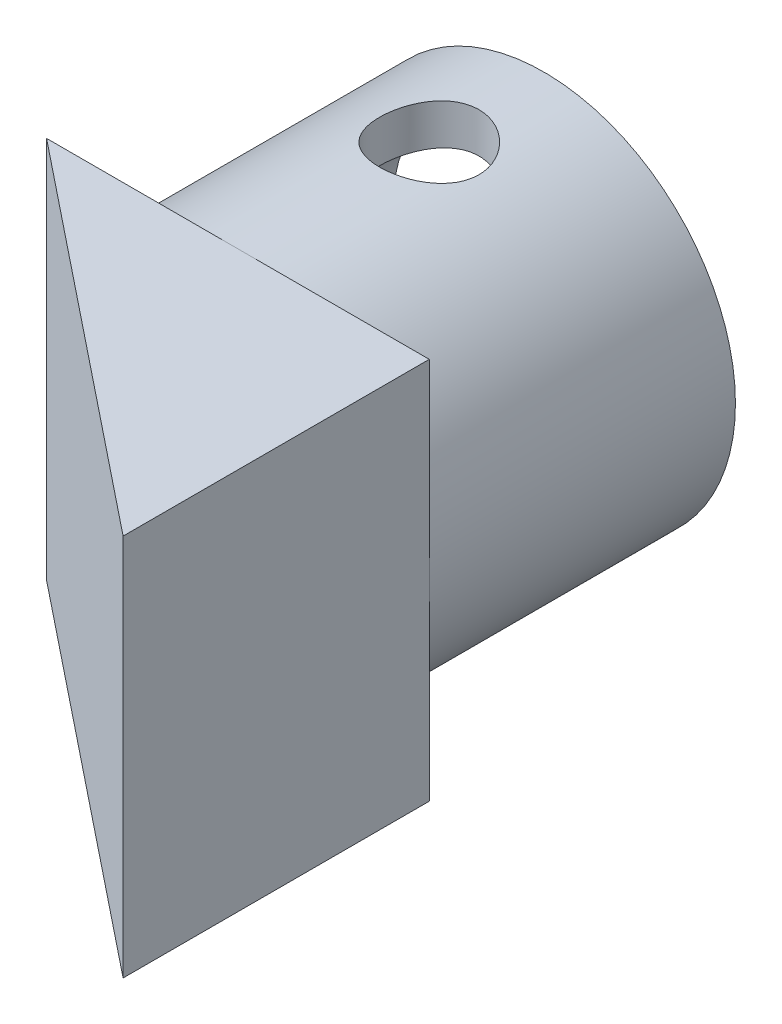
ISO-10303-21;
HEADER;
FILE_DESCRIPTION(('STEP AP214'),'2;1');
FILE_NAME('part.step','',(''),(''),'','','');
FILE_SCHEMA(('AUTOMOTIVE_DESIGN { 1 0 10303 214 1 1 1 1 }'));
ENDSEC;
DATA;
#1=APPLICATION_CONTEXT('core data for automotive mechanical design processes');
#2=APPLICATION_PROTOCOL_DEFINITION('international standard','automotive_design',2000,#1);
#3=PRODUCT_CONTEXT('',#1,'mechanical');
#4=PRODUCT('Part','Part','',(#3));
#5=PRODUCT_RELATED_PRODUCT_CATEGORY('part','',(#4));
#6=PRODUCT_DEFINITION_FORMATION('','',#4);
#7=PRODUCT_DEFINITION_CONTEXT('part definition',#1,'design');
#8=PRODUCT_DEFINITION('design','',#6,#7);
#9=PRODUCT_DEFINITION_SHAPE('','',#8);
#10=(LENGTH_UNIT() NAMED_UNIT(*) SI_UNIT(.MILLI.,.METRE.));
#11=(NAMED_UNIT(*) PLANE_ANGLE_UNIT() SI_UNIT($,.RADIAN.));
#12=(NAMED_UNIT(*) SI_UNIT($,.STERADIAN.) SOLID_ANGLE_UNIT());
#13=UNCERTAINTY_MEASURE_WITH_UNIT(LENGTH_MEASURE(1.E-05),#10,'distance_accuracy_value','');
#14=(GEOMETRIC_REPRESENTATION_CONTEXT(3) GLOBAL_UNCERTAINTY_ASSIGNED_CONTEXT((#13)) GLOBAL_UNIT_ASSIGNED_CONTEXT((#10,
#11,#12)) REPRESENTATION_CONTEXT('',''));
#15=CARTESIAN_POINT('',(0.,0.,0.));
#16=DIRECTION('',(0.,0.,1.));
#17=DIRECTION('',(1.,0.,0.));
#18=AXIS2_PLACEMENT_3D('',#15,#16,#17);
#19=CARTESIAN_POINT('',(0.,0.,0.));
#20=DIRECTION('',(0.,0.,1.));
#21=DIRECTION('',(1.,0.,0.));
#22=AXIS2_PLACEMENT_3D('',#19,#20,#21);
#23=PLANE('',#22);
#24=CARTESIAN_POINT('',(0.,0.,0.));
#25=DIRECTION('',(0.,0.,1.));
#26=DIRECTION('',(1.,0.,0.));
#27=AXIS2_PLACEMENT_3D('',#24,#25,#26);
#28=CIRCLE('',#27,5.);
#29=CARTESIAN_POINT('',(5.,0.,0.));
#30=VERTEX_POINT('',#29);
#31=EDGE_CURVE('E134',#30,#30,#28,.T.);
#32=ORIENTED_EDGE('',*,*,#31,.F.);
#33=EDGE_LOOP('',(#32));
#34=FACE_BOUND('',#33,.T.);
#35=CARTESIAN_POINT('',(0.,0.,0.));
#36=DIRECTION('',(0.,0.,1.));
#37=DIRECTION('',(1.,0.,0.));
#38=AXIS2_PLACEMENT_3D('',#35,#36,#37);
#39=CIRCLE('',#38,3.95);
#40=CARTESIAN_POINT('',(3.95,0.,0.));
#41=VERTEX_POINT('',#40);
#42=EDGE_CURVE('E132',#41,#41,#39,.T.);
#43=ORIENTED_EDGE('',*,*,#42,.T.);
#44=EDGE_LOOP('',(#43));
#45=FACE_BOUND('',#44,.T.);
#46=ADVANCED_FACE('F33',(#34,#45),#23,.F.);
#47=CARTESIAN_POINT('',(0.,0.,8.));
#48=DIRECTION('',(0.,0.,-1.));
#49=DIRECTION('',(-1.,0.,0.));
#50=AXIS2_PLACEMENT_3D('',#47,#48,#49);
#51=CYLINDRICAL_SURFACE('',#50,5.);
#52=CARTESIAN_POINT('',(0.,-5.,4.3));
#53=CARTESIAN_POINT('',(0.0717307786716109,-4.99999885912454,4.29999816586154));
#54=CARTESIAN_POINT('',(0.143481538947281,-4.998441140995,4.29404317706765));
#55=CARTESIAN_POINT('',(0.284920413497907,-4.99237823364744,4.2704200751648));
#56=CARTESIAN_POINT('',(0.354607444099347,-4.98787152361252,4.25274591833176));
#57=CARTESIAN_POINT('',(0.489856453463625,-4.97640871761101,4.20629469406177));
#58=CARTESIAN_POINT('',(0.555423483742325,-4.96945569296409,4.1775315444106));
#59=CARTESIAN_POINT('',(0.68080247992251,-4.95383737776702,4.10976934681149));
#60=CARTESIAN_POINT('',(0.740614138181474,-4.94517199576156,4.07076975210864));
#61=CARTESIAN_POINT('',(0.854108529262041,-4.92685216626646,3.98273009067953));
#62=CARTESIAN_POINT('',(0.907645708599976,-4.91718147538334,3.93350576070611));
#63=CARTESIAN_POINT('',(1.0058054182008,-4.89804673326225,3.82680807084766));
#64=CARTESIAN_POINT('',(1.05042685981889,-4.88858270738436,3.76933370507305));
#65=CARTESIAN_POINT('',(1.13018788316099,-4.87076767855598,3.64661851125556));
#66=CARTESIAN_POINT('',(1.16516190324781,-4.86243722215411,3.58126681773134));
#67=CARTESIAN_POINT('',(1.22356960439174,-4.84807058079245,3.44535959205325));
#68=CARTESIAN_POINT('',(1.24700529718818,-4.84203399593172,3.37480496951268));
#69=CARTESIAN_POINT('',(1.281169228899,-4.83310598130334,3.23210205052739));
#70=CARTESIAN_POINT('',(1.29216048290362,-4.83014956376373,3.16002088452016));
#71=CARTESIAN_POINT('',(1.3019432296733,-4.82752230668979,3.01498176997082));
#72=CARTESIAN_POINT('',(1.30073688084738,-4.82785088586354,2.94202397883275));
#73=CARTESIAN_POINT('',(1.2863678960504,-4.83169822957429,2.79934028716682));
#74=CARTESIAN_POINT('',(1.2735215273875,-4.83513260277125,2.72957990208878));
#75=CARTESIAN_POINT('',(1.23674288104121,-4.84466969943908,2.59324021046968));
#76=CARTESIAN_POINT('',(1.21280975642708,-4.85077262676204,2.52666114738238));
#77=CARTESIAN_POINT('',(1.15427447680391,-4.86503471141451,2.39774002853324));
#78=CARTESIAN_POINT('',(1.11955986166448,-4.87321536914182,2.33545151285766));
#79=CARTESIAN_POINT('',(1.04052555441476,-4.89069936804917,2.21747178012729));
#80=CARTESIAN_POINT('',(0.996204056417375,-4.90000292016326,2.16178180650457));
#81=CARTESIAN_POINT('',(0.897588399354158,-4.9190373655284,2.0567707801978));
#82=CARTESIAN_POINT('',(0.843028117151478,-4.92877257463288,2.00770008928812));
#83=CARTESIAN_POINT('',(0.726334791666221,-4.947314710364,1.91935513083208));
#84=CARTESIAN_POINT('',(0.664201478488647,-4.95612160388557,1.88008121258463));
#85=CARTESIAN_POINT('',(0.533750553018985,-4.97186464472852,1.81234191921762));
#86=CARTESIAN_POINT('',(0.465409427094992,-4.97879324641701,1.78391995820683));
#87=CARTESIAN_POINT('',(0.324698261892371,-4.98994437896931,1.73903950096387));
#88=CARTESIAN_POINT('',(0.25232906151994,-4.99416747102063,1.72257852364206));
#89=CARTESIAN_POINT('',(0.107754265628856,-4.99934762845146,1.70247601810568));
#90=CARTESIAN_POINT('',(0.0355990679618569,-5.00039144909205,1.69849388039378));
#91=CARTESIAN_POINT('',(-0.108347558385988,-4.9993439302767,1.70252407708697));
#92=CARTESIAN_POINT('',(-0.180139021986154,-4.99725289772412,1.71053523734338));
#93=CARTESIAN_POINT('',(-0.320117661841459,-4.9902264842307,1.73804465756627));
#94=CARTESIAN_POINT('',(-0.3883443967086,-4.98533775354441,1.75735463113079));
#95=CARTESIAN_POINT('',(-0.520584855265785,-4.97326895706077,1.80669635149957));
#96=CARTESIAN_POINT('',(-0.584598133561371,-4.966088649494,1.83672922964772));
#97=CARTESIAN_POINT('',(-0.707930992016775,-4.95002802767655,1.90730750951055));
#98=CARTESIAN_POINT('',(-0.767139321552233,-4.94111821378144,1.94804043928579));
#99=CARTESIAN_POINT('',(-0.878000441471827,-4.92262930746647,2.03862522166252));
#100=CARTESIAN_POINT('',(-0.929651812778711,-4.91305008984093,2.08847878302904));
#101=CARTESIAN_POINT('',(-1.02535533145664,-4.89398559724572,2.19747610283433));
#102=CARTESIAN_POINT('',(-1.0691676974822,-4.88450966299983,2.25683240802754));
#103=CARTESIAN_POINT('',(-1.14621298401497,-4.86700757475785,2.38225303325104));
#104=CARTESIAN_POINT('',(-1.1794463607291,-4.85898135825078,2.44831706385618));
#105=CARTESIAN_POINT('',(-1.23414034237999,-4.84537844502717,2.58493610486184));
#106=CARTESIAN_POINT('',(-1.25567007103908,-4.83978740561989,2.65546193804776));
#107=CARTESIAN_POINT('',(-1.28651743722663,-4.83168004742566,2.79930171484937));
#108=CARTESIAN_POINT('',(-1.29583800946139,-4.82916298975776,2.87261498408958));
#109=CARTESIAN_POINT('',(-1.30183988013393,-4.82754813134566,3.01749983369733));
#110=CARTESIAN_POINT('',(-1.29890566929442,-4.82834631145179,3.08905457201614));
#111=CARTESIAN_POINT('',(-1.28136829919157,-4.83302969132189,3.2306112653395));
#112=CARTESIAN_POINT('',(-1.26676541261453,-4.83691481894669,3.30061325659105));
#113=CARTESIAN_POINT('',(-1.22652296626336,-4.84727400349191,3.43662027692297));
#114=CARTESIAN_POINT('',(-1.20096107281371,-4.85372981947422,3.5026497724797));
#115=CARTESIAN_POINT('',(-1.13958690119683,-4.86850424398437,3.62953183040472));
#116=CARTESIAN_POINT('',(-1.10377308914157,-4.87682313122364,3.6903836163174));
#117=CARTESIAN_POINT('',(-1.02173013022611,-4.89467814244603,3.8070274672692));
#118=CARTESIAN_POINT('',(-0.975236798928221,-4.90424188358561,3.86262951434169));
#119=CARTESIAN_POINT('',(-0.87366206477925,-4.92335054739323,3.96536747478793));
#120=CARTESIAN_POINT('',(-0.818578597936101,-4.93289546497886,4.01250134760105));
#121=CARTESIAN_POINT('',(-0.700055598942872,-4.95111947868785,4.09789014611913));
#122=CARTESIAN_POINT('',(-0.636470787048337,-4.9597774014975,4.13594830359197));
#123=CARTESIAN_POINT('',(-0.503584101499031,-4.97502379799897,4.20077479935966));
#124=CARTESIAN_POINT('',(-0.434286110017087,-4.9816136625622,4.22755072968078));
#125=CARTESIAN_POINT('',(-0.304324490623244,-4.99107925028337,4.26536273677146));
#126=CARTESIAN_POINT('',(-0.244245830872915,-4.99440072931575,4.27832240703174));
#127=CARTESIAN_POINT('',(-0.122782916586036,-4.99886149574191,4.29564144249486));
#128=CARTESIAN_POINT('',(-0.0613987782532484,-5.00000097654536,4.30000156995174));
#129=CARTESIAN_POINT('',(0.,-5.,4.3));
#130=B_SPLINE_CURVE_WITH_KNOTS('',3,(#52,#53,#54,#55,#56,#57,#58,#59,#60,#61,#62,#63,#64,#65,
#66,#67,#68,#69,#70,#71,#72,#73,#74,#75,#76,#77,#78,#79,#80,#81,#82,#83,#84,#85,#86,#87,#88,#89,
#90,#91,#92,#93,#94,#95,#96,#97,#98,#99,#100,#101,#102,#103,#104,#105,#106,#107,#108,#109,#110,
#111,#112,#113,#114,#115,#116,#117,#118,#119,#120,#121,#122,#123,#124,#125,#126,#127,#128,#129),
.UNSPECIFIED.,.T.,.F.,(4,2,2,2,2,2,2,2,2,2,2,2,2,2,2,2,2,2,2,2,2,2,2,2,2,2,2,2,2,2,2,2,2,2,2,2,
2,2,4),(0.,0.214967237033415,0.43004542172036,0.64485453617895,0.859675126481417,
1.07876816860036,1.29788794646979,1.52056237814132,1.74319797214783,1.96103475933145,
2.17883300019886,2.39088534386669,2.60295388914234,2.8173133212086,3.03171308323144,
3.25274629224052,3.47378738094936,3.69570372080879,3.91757401498792,4.13333313105578,
4.34907112560078,4.56131245775761,4.77357618952829,4.98984196043499,5.20614829065226,
5.42823125959202,5.65030465015768,5.87105177957784,6.09174583842406,6.30556854774109,
6.51938626036272,6.73171306829717,6.94407166110446,7.16239228611878,7.38076544910422,
7.60351288552391,7.82611019062644,8.01013016140658,8.19413382012542),.UNSPECIFIED.);
#131=CARTESIAN_POINT('',(0.,-5.,4.3));
#132=VERTEX_POINT('',#131);
#133=EDGE_CURVE('E97',#132,#132,#130,.T.);
#134=ORIENTED_EDGE('',*,*,#133,.T.);
#135=EDGE_LOOP('',(#134));
#136=FACE_BOUND('',#135,.T.);
#137=CARTESIAN_POINT('',(0.,5.,4.3));
#138=CARTESIAN_POINT('',(-0.0717307786716105,4.99999885912454,4.29999816586154));
#139=CARTESIAN_POINT('',(-0.14348153894728,4.998441140995,4.29404317706765));
#140=CARTESIAN_POINT('',(-0.284920413497907,4.99237823364744,4.2704200751648));
#141=CARTESIAN_POINT('',(-0.354607444099346,4.98787152361252,4.25274591833175));
#142=CARTESIAN_POINT('',(-0.489856453463625,4.97640871761101,4.20629469406177));
#143=CARTESIAN_POINT('',(-0.555423483742325,4.96945569296409,4.1775315444106));
#144=CARTESIAN_POINT('',(-0.680802479922511,4.95383737776702,4.10976934681149));
#145=CARTESIAN_POINT('',(-0.740614138181474,4.94517199576156,4.07076975210864));
#146=CARTESIAN_POINT('',(-0.854108529262042,4.92685216626645,3.98273009067953));
#147=CARTESIAN_POINT('',(-0.907645708599977,4.91718147538334,3.93350576070611));
#148=CARTESIAN_POINT('',(-1.0058054182008,4.89804673326225,3.82680807084766));
#149=CARTESIAN_POINT('',(-1.05042685981889,4.88858270738436,3.76933370507305));
#150=CARTESIAN_POINT('',(-1.13018788316099,4.87076767855598,3.64661851125556));
#151=CARTESIAN_POINT('',(-1.16516190324781,4.86243722215411,3.58126681773134));
#152=CARTESIAN_POINT('',(-1.22356960439173,4.84807058079245,3.44535959205325));
#153=CARTESIAN_POINT('',(-1.24700529718818,4.84203399593172,3.37480496951268));
#154=CARTESIAN_POINT('',(-1.281169228899,4.83310598130334,3.23210205052739));
#155=CARTESIAN_POINT('',(-1.29216048290362,4.83014956376373,3.16002088452016));
#156=CARTESIAN_POINT('',(-1.3019432296733,4.82752230668979,3.01498176997082));
#157=CARTESIAN_POINT('',(-1.30073688084738,4.82785088586354,2.94202397883275));
#158=CARTESIAN_POINT('',(-1.2863678960504,4.83169822957429,2.79934028716682));
#159=CARTESIAN_POINT('',(-1.2735215273875,4.83513260277125,2.72957990208878));
#160=CARTESIAN_POINT('',(-1.23674288104121,4.84466969943908,2.59324021046968));
#161=CARTESIAN_POINT('',(-1.21280975642707,4.85077262676204,2.52666114738238));
#162=CARTESIAN_POINT('',(-1.15427447680391,4.86503471141451,2.39774002853323));
#163=CARTESIAN_POINT('',(-1.11955986166448,4.87321536914182,2.33545151285766));
#164=CARTESIAN_POINT('',(-1.04052555441475,4.89069936804917,2.21747178012729));
#165=CARTESIAN_POINT('',(-0.996204056417374,4.90000292016326,2.16178180650457));
#166=CARTESIAN_POINT('',(-0.897588399354156,4.9190373655284,2.0567707801978));
#167=CARTESIAN_POINT('',(-0.843028117151477,4.92877257463288,2.00770008928812));
#168=CARTESIAN_POINT('',(-0.72633479166622,4.947314710364,1.91935513083208));
#169=CARTESIAN_POINT('',(-0.664201478488645,4.95612160388557,1.88008121258463));
#170=CARTESIAN_POINT('',(-0.533750553018983,4.97186464472852,1.81234191921762));
#171=CARTESIAN_POINT('',(-0.46540942709499,4.97879324641701,1.78391995820683));
#172=CARTESIAN_POINT('',(-0.324698261892369,4.98994437896931,1.73903950096387));
#173=CARTESIAN_POINT('',(-0.252329061519938,4.99416747102063,1.72257852364206));
#174=CARTESIAN_POINT('',(-0.107754265628854,4.99934762845146,1.70247601810568));
#175=CARTESIAN_POINT('',(-0.0355990679618548,5.00039144909205,1.69849388039378));
#176=CARTESIAN_POINT('',(0.10834755838599,4.9993439302767,1.70252407708697));
#177=CARTESIAN_POINT('',(0.180139021986156,4.99725289772412,1.71053523734338));
#178=CARTESIAN_POINT('',(0.320117661841461,4.9902264842307,1.73804465756627));
#179=CARTESIAN_POINT('',(0.388344396708602,4.98533775354441,1.75735463113079));
#180=CARTESIAN_POINT('',(0.520584855265786,4.97326895706077,1.80669635149957));
#181=CARTESIAN_POINT('',(0.584598133561373,4.966088649494,1.83672922964772));
#182=CARTESIAN_POINT('',(0.707930992016777,4.95002802767655,1.90730750951055));
#183=CARTESIAN_POINT('',(0.767139321552235,4.94111821378144,1.94804043928579));
#184=CARTESIAN_POINT('',(0.878000441471829,4.92262930746647,2.03862522166252));
#185=CARTESIAN_POINT('',(0.929651812778713,4.91305008984093,2.08847878302904));
#186=CARTESIAN_POINT('',(1.02535533145664,4.89398559724572,2.19747610283433));
#187=CARTESIAN_POINT('',(1.0691676974822,4.88450966299983,2.25683240802754));
#188=CARTESIAN_POINT('',(1.14621298401497,4.86700757475785,2.38225303325104));
#189=CARTESIAN_POINT('',(1.1794463607291,4.85898135825078,2.44831706385618));
#190=CARTESIAN_POINT('',(1.23414034237999,4.84537844502717,2.58493610486184));
#191=CARTESIAN_POINT('',(1.25567007103908,4.83978740561989,2.65546193804776));
#192=CARTESIAN_POINT('',(1.28651743722663,4.83168004742566,2.79930171484937));
#193=CARTESIAN_POINT('',(1.29583800946139,4.82916298975776,2.87261498408958));
#194=CARTESIAN_POINT('',(1.30183988013393,4.82754813134566,3.01749983369733));
#195=CARTESIAN_POINT('',(1.29890566929442,4.82834631145179,3.08905457201614));
#196=CARTESIAN_POINT('',(1.28136829919157,4.83302969132189,3.2306112653395));
#197=CARTESIAN_POINT('',(1.26676541261453,4.83691481894669,3.30061325659105));
#198=CARTESIAN_POINT('',(1.22652296626336,4.84727400349191,3.43662027692297));
#199=CARTESIAN_POINT('',(1.20096107281371,4.85372981947422,3.5026497724797));
#200=CARTESIAN_POINT('',(1.13958690119683,4.86850424398437,3.62953183040472));
#201=CARTESIAN_POINT('',(1.10377308914157,4.87682313122364,3.6903836163174));
#202=CARTESIAN_POINT('',(1.02173013022611,4.89467814244603,3.8070274672692));
#203=CARTESIAN_POINT('',(0.97523679892822,4.90424188358561,3.86262951434169));
#204=CARTESIAN_POINT('',(0.873662064779249,4.92335054739323,3.96536747478793));
#205=CARTESIAN_POINT('',(0.818578597936101,4.93289546497886,4.01250134760106));
#206=CARTESIAN_POINT('',(0.700055598942872,4.95111947868785,4.09789014611913));
#207=CARTESIAN_POINT('',(0.636470787048337,4.9597774014975,4.13594830359197));
#208=CARTESIAN_POINT('',(0.50358410149903,4.97502379799897,4.20077479935966));
#209=CARTESIAN_POINT('',(0.434286110017086,4.9816136625622,4.22755072968078));
#210=CARTESIAN_POINT('',(0.304324490623243,4.99107925028337,4.26536273677146));
#211=CARTESIAN_POINT('',(0.244245830872914,4.99440072931575,4.27832240703174));
#212=CARTESIAN_POINT('',(0.122782916586035,4.99886149574191,4.29564144249486));
#213=CARTESIAN_POINT('',(0.061398778253248,5.00000097654536,4.30000156995174));
#214=CARTESIAN_POINT('',(0.,5.,4.3));
#215=B_SPLINE_CURVE_WITH_KNOTS('',3,(#137,#138,#139,#140,#141,#142,#143,#144,#145,#146,#147,
#148,#149,#150,#151,#152,#153,#154,#155,#156,#157,#158,#159,#160,#161,#162,#163,#164,#165,#166,
#167,#168,#169,#170,#171,#172,#173,#174,#175,#176,#177,#178,#179,#180,#181,#182,#183,#184,#185,
#186,#187,#188,#189,#190,#191,#192,#193,#194,#195,#196,#197,#198,#199,#200,#201,#202,#203,#204,
#205,#206,#207,#208,#209,#210,#211,#212,#213,#214),.UNSPECIFIED.,.T.,.F.,(4,2,2,2,2,2,2,2,2,2,2,
2,2,2,2,2,2,2,2,2,2,2,2,2,2,2,2,2,2,2,2,2,2,2,2,2,2,2,4),(0.,0.214967237033415,0.43004542172036,
0.64485453617895,0.859675126481418,1.07876816860036,1.29788794646979,1.52056237814133,
1.74319797214784,1.96103475933145,2.17883300019886,2.39088534386669,2.60295388914234,
2.8173133212086,3.03171308323144,3.25274629224052,3.47378738094936,3.69570372080879,
3.91757401498792,4.13333313105578,4.34907112560078,4.56131245775761,4.77357618952829,
4.98984196043499,5.20614829065226,5.42823125959202,5.65030465015768,5.87105177957784,
6.09174583842406,6.30556854774109,6.51938626036272,6.73171306829716,6.94407166110446,
7.16239228611877,7.38076544910422,7.60351288552391,7.82611019062644,8.01013016140658,
8.19413382012542),.UNSPECIFIED.);
#216=CARTESIAN_POINT('',(0.,5.,4.3));
#217=VERTEX_POINT('',#216);
#218=EDGE_CURVE('E156',#217,#217,#215,.T.);
#219=ORIENTED_EDGE('',*,*,#218,.T.);
#220=EDGE_LOOP('',(#219));
#221=FACE_BOUND('',#220,.T.);
#222=CARTESIAN_POINT('',(0.,0.,8.));
#223=DIRECTION('',(0.,0.,1.));
#224=DIRECTION('',(1.,0.,0.));
#225=AXIS2_PLACEMENT_3D('',#222,#223,#224);
#226=CIRCLE('',#225,5.);
#227=CARTESIAN_POINT('',(5.,0.,8.));
#228=VERTEX_POINT('',#227);
#229=CARTESIAN_POINT('',(0.,5.,8.));
#230=VERTEX_POINT('',#229);
#231=EDGE_CURVE('E11',#228,#230,#226,.T.);
#232=ORIENTED_EDGE('',*,*,#231,.F.);
#233=CARTESIAN_POINT('',(0.,-5.,8.));
#234=VERTEX_POINT('',#233);
#235=EDGE_CURVE('E50',#234,#228,#226,.T.);
#236=ORIENTED_EDGE('',*,*,#235,.F.);
#237=CARTESIAN_POINT('',(-5.,0.,8.));
#238=VERTEX_POINT('',#237);
#239=EDGE_CURVE('E60',#238,#234,#226,.T.);
#240=ORIENTED_EDGE('',*,*,#239,.F.);
#241=EDGE_CURVE('E48',#230,#238,#226,.T.);
#242=ORIENTED_EDGE('',*,*,#241,.F.);
#243=EDGE_LOOP('',(#232,#236,#240,#242));
#244=FACE_BOUND('',#243,.T.);
#245=ORIENTED_EDGE('',*,*,#31,.T.);
#246=EDGE_LOOP('',(#245));
#247=FACE_BOUND('',#246,.T.);
#248=ADVANCED_FACE('F35',(#136,#221,#244,#247),#51,.T.);
#249=CARTESIAN_POINT('',(0.,0.,8.));
#250=DIRECTION('',(0.,0.,-1.));
#251=DIRECTION('',(-1.,0.,0.));
#252=AXIS2_PLACEMENT_3D('',#249,#250,#251);
#253=CYLINDRICAL_SURFACE('',#252,3.95);
#254=CARTESIAN_POINT('',(0.,-3.95,4.3));
#255=CARTESIAN_POINT('',(0.0709829610794788,-3.95000007319669,4.30000015496706));
#256=CARTESIAN_POINT('',(0.14196536135004,-3.94806888480818,4.29416728741721));
#257=CARTESIAN_POINT('',(0.281842460307813,-3.94055500859883,4.27105919979852));
#258=CARTESIAN_POINT('',(0.350736888829278,-3.93497185033702,4.2537825055504));
#259=CARTESIAN_POINT('',(0.484401191575012,-3.92076136710928,4.20844096000981));
#260=CARTESIAN_POINT('',(0.549177652461634,-3.9121390556356,4.18039386915953));
#261=CARTESIAN_POINT('',(0.673107429858449,-3.89273244747134,4.11438698716866));
#262=CARTESIAN_POINT('',(0.732259678531228,-3.88194774142271,4.0764253187093));
#263=CARTESIAN_POINT('',(0.845265075149385,-3.85894489751455,3.99031612890366));
#264=CARTESIAN_POINT('',(0.898901369978049,-3.84669305468934,3.94189307254206));
#265=CARTESIAN_POINT('',(0.997456700192528,-3.82232422733423,3.83682165173222));
#266=CARTESIAN_POINT('',(1.04237387990989,-3.81020727202824,3.78017154081459));
#267=CARTESIAN_POINT('',(1.1234408644698,-3.78711121004201,3.65831739712311));
#268=CARTESIAN_POINT('',(1.15931106042597,-3.77617328695265,3.59291879013108));
#269=CARTESIAN_POINT('',(1.21945167342663,-3.75718505179296,3.45659912705684));
#270=CARTESIAN_POINT('',(1.24372552881538,-3.74913388396926,3.38567971516913));
#271=CARTESIAN_POINT('',(1.27917503844399,-3.73718516362997,3.24279371838596));
#272=CARTESIAN_POINT('',(1.29075620504918,-3.73315940217963,3.17093877498848));
#273=CARTESIAN_POINT('',(1.30175911632934,-3.72933778753418,3.02620155686063));
#274=CARTESIAN_POINT('',(1.30118450700256,-3.72954066600234,2.95331959672737));
#275=CARTESIAN_POINT('',(1.2882075087873,-3.73404088461962,2.81203373626257));
#276=CARTESIAN_POINT('',(1.2763314294693,-3.7381560226238,2.74357469058409));
#277=CARTESIAN_POINT('',(1.24194610977985,-3.7497193934349,2.60968097377534));
#278=CARTESIAN_POINT('',(1.21943562623389,-3.75716801592475,2.54424665722159));
#279=CARTESIAN_POINT('',(1.16407040176717,-3.77469092256335,2.4170521138585));
#280=CARTESIAN_POINT('',(1.13105780106689,-3.78480484262511,2.35536629655166));
#281=CARTESIAN_POINT('',(1.05573504075254,-3.80650183445498,2.23824219729294));
#282=CARTESIAN_POINT('',(1.0134222502111,-3.81808532155556,2.18280568993326));
#283=CARTESIAN_POINT('',(0.918161106732507,-3.84213602985152,2.07679261318661));
#284=CARTESIAN_POINT('',(0.864781593451721,-3.85461824878812,2.02660610268542));
#285=CARTESIAN_POINT('',(0.750209988414886,-3.87854424723023,1.93579673630937));
#286=CARTESIAN_POINT('',(0.689017185410522,-3.88998793203492,1.89517475205752));
#287=CARTESIAN_POINT('',(0.559744462015839,-3.91069118030887,1.82434398654903));
#288=CARTESIAN_POINT('',(0.49160487665367,-3.91992906245069,1.79423732821378));
#289=CARTESIAN_POINT('',(0.350851932060614,-3.9350226581483,1.74603371751428));
#290=CARTESIAN_POINT('',(0.278240095231164,-3.94087951567502,1.72793270272698));
#291=CARTESIAN_POINT('',(0.133907777181065,-3.94836276643493,1.70493970975314));
#292=CARTESIAN_POINT('',(0.0622799280435583,-3.95015792191676,1.69952046048883));
#293=CARTESIAN_POINT('',(-0.080874434703633,-3.94982019483739,1.70054603172145));
#294=CARTESIAN_POINT('',(-0.152400963007653,-3.94768795651755,1.7069889063806));
#295=CARTESIAN_POINT('',(-0.291227855065199,-3.93984632587967,1.73113729714739));
#296=CARTESIAN_POINT('',(-0.358590496320938,-3.93423914132638,1.74852122648915));
#297=CARTESIAN_POINT('',(-0.489417776330051,-3.92011519057551,1.79365820032025));
#298=CARTESIAN_POINT('',(-0.552881919398139,-3.91159805528393,1.82141256022208));
#299=CARTESIAN_POINT('',(-0.675944292882697,-3.89224643648506,1.88730191155046));
#300=CARTESIAN_POINT('',(-0.735399599198763,-3.88135758816091,1.92568742409159));
#301=CARTESIAN_POINT('',(-0.847197627537397,-3.85849938864648,2.01145387506343));
#302=CARTESIAN_POINT('',(-0.899538218222749,-3.84652971545561,2.05883749889035));
#303=CARTESIAN_POINT('',(-0.998029128419559,-3.82218877391626,2.16373522222728));
#304=CARTESIAN_POINT('',(-1.04380324807566,-3.80982315984666,2.22160470226723));
#305=CARTESIAN_POINT('',(-1.12503463563222,-3.78663273975186,2.34446983447141));
#306=CARTESIAN_POINT('',(-1.16049187612873,-3.77580793781943,2.40946550556379));
#307=CARTESIAN_POINT('',(-1.21990529933038,-3.75703410640062,2.54472890444885));
#308=CARTESIAN_POINT('',(-1.24388973000913,-3.74907802567282,2.61498318573575));
#309=CARTESIAN_POINT('',(-1.27958419134187,-3.73704776555513,2.7588543970303));
#310=CARTESIAN_POINT('',(-1.29129956872311,-3.73297189527993,2.83246984766635));
#311=CARTESIAN_POINT('',(-1.3017129830352,-3.72935255258117,2.97700571424406));
#312=CARTESIAN_POINT('',(-1.30103388967695,-3.72959220035743,3.04787633373853));
#313=CARTESIAN_POINT('',(-1.28820451606761,-3.73404260303012,3.18843802953583));
#314=CARTESIAN_POINT('',(-1.27605488625723,-3.73825313275631,3.25812917249318));
#315=CARTESIAN_POINT('',(-1.24106544064758,-3.75001139104323,3.3931056292899));
#316=CARTESIAN_POINT('',(-1.21842244972763,-3.7574975400071,3.45844774727636));
#317=CARTESIAN_POINT('',(-1.16324748256122,-3.77494219323695,3.58445605209423));
#318=CARTESIAN_POINT('',(-1.13071334686503,-3.78490123730203,3.64512121421631));
#319=CARTESIAN_POINT('',(-1.05505697496557,-3.80670007161102,3.76286197608261));
#320=CARTESIAN_POINT('',(-1.01154177410332,-3.81860203416956,3.81967349820157));
#321=CARTESIAN_POINT('',(-0.915828422105698,-3.84268011210813,3.92538928804488));
#322=CARTESIAN_POINT('',(-0.863627844240041,-3.85485630328434,3.97429133827809));
#323=CARTESIAN_POINT('',(-0.749665815985926,-3.87866086303045,4.06465216852757));
#324=CARTESIAN_POINT('',(-0.687618514208386,-3.89025137725221,4.10576162665907));
#325=CARTESIAN_POINT('',(-0.55711633930698,-3.91107127668562,4.1769199425958));
#326=CARTESIAN_POINT('',(-0.488663298715251,-3.92030133436528,4.20697195161911));
#327=CARTESIAN_POINT('',(-0.351026862609448,-3.93494752746253,4.25370601462609));
#328=CARTESIAN_POINT('',(-0.282074158010249,-3.94053976608284,4.27101187422552));
#329=CARTESIAN_POINT('',(-0.142080417052831,-3.94806549083472,4.29415730108766));
#330=CARTESIAN_POINT('',(-0.0710399276717049,-3.94999992674457,4.29999984490858));
#331=CARTESIAN_POINT('',(0.,-3.95,4.3));
#332=B_SPLINE_CURVE_WITH_KNOTS('',3,(#254,#255,#256,#257,#258,#259,#260,#261,#262,#263,#264,
#265,#266,#267,#268,#269,#270,#271,#272,#273,#274,#275,#276,#277,#278,#279,#280,#281,#282,#283,
#284,#285,#286,#287,#288,#289,#290,#291,#292,#293,#294,#295,#296,#297,#298,#299,#300,#301,#302,
#303,#304,#305,#306,#307,#308,#309,#310,#311,#312,#313,#314,#315,#316,#317,#318,#319,#320,#321,
#322,#323,#324,#325,#326,#327,#328,#329,#330,#331),.UNSPECIFIED.,.T.,.F.,(4,2,2,2,2,2,2,2,2,2,2,
2,2,2,2,2,2,2,2,2,2,2,2,2,2,2,2,2,2,2,2,2,2,2,2,2,2,2,4),(0.,0.21268752357525,0.425402450617592,
0.63776810548607,0.850174000841619,1.06906314379544,1.28799882144892,1.51304348702423,
1.73802138481084,1.95558076606883,2.17307489358419,2.3809118534688,2.58877311575606,
2.79991944977384,3.01112559195614,3.23306326797123,3.4550211615252,3.67907835383957,
3.90305969181944,4.11754903269423,4.33200319232519,4.54043083618269,4.74888492652624,
4.9627445204427,5.1766680392046,5.40005360546788,5.62343976508835,5.84627304291175,
6.06900917182374,6.28058421457521,6.49214726061179,6.69989333042927,6.90768478829358,
7.12435351639361,7.34108288460678,7.56596749637109,7.79078796944134,8.0037014753647,
8.21655968896532),.UNSPECIFIED.);
#333=CARTESIAN_POINT('',(0.,-3.95,4.3));
#334=VERTEX_POINT('',#333);
#335=EDGE_CURVE('E38',#334,#334,#332,.T.);
#336=ORIENTED_EDGE('',*,*,#335,.F.);
#337=EDGE_LOOP('',(#336));
#338=FACE_BOUND('',#337,.T.);
#339=CARTESIAN_POINT('',(0.,3.95,4.3));
#340=CARTESIAN_POINT('',(-0.070982961079478,3.95000007319669,4.30000015496706));
#341=CARTESIAN_POINT('',(-0.141965361350039,3.94806888480818,4.29416728741721));
#342=CARTESIAN_POINT('',(-0.281842460307813,3.94055500859883,4.27105919979852));
#343=CARTESIAN_POINT('',(-0.350736888829277,3.93497185033702,4.2537825055504));
#344=CARTESIAN_POINT('',(-0.484401191575012,3.92076136710928,4.20844096000981));
#345=CARTESIAN_POINT('',(-0.549177652461633,3.9121390556356,4.18039386915953));
#346=CARTESIAN_POINT('',(-0.673107429858448,3.89273244747134,4.11438698716866));
#347=CARTESIAN_POINT('',(-0.732259678531227,3.88194774142271,4.0764253187093));
#348=CARTESIAN_POINT('',(-0.845265075149384,3.85894489751455,3.99031612890366));
#349=CARTESIAN_POINT('',(-0.898901369978049,3.84669305468934,3.94189307254206));
#350=CARTESIAN_POINT('',(-0.997456700192527,3.82232422733423,3.83682165173222));
#351=CARTESIAN_POINT('',(-1.04237387990989,3.81020727202824,3.78017154081459));
#352=CARTESIAN_POINT('',(-1.1234408644698,3.78711121004201,3.65831739712311));
#353=CARTESIAN_POINT('',(-1.15931106042597,3.77617328695265,3.59291879013108));
#354=CARTESIAN_POINT('',(-1.21945167342663,3.75718505179296,3.45659912705684));
#355=CARTESIAN_POINT('',(-1.24372552881538,3.74913388396926,3.38567971516913));
#356=CARTESIAN_POINT('',(-1.27917503844399,3.73718516362997,3.24279371838596));
#357=CARTESIAN_POINT('',(-1.29075620504918,3.73315940217963,3.17093877498848));
#358=CARTESIAN_POINT('',(-1.30175911632934,3.72933778753418,3.02620155686063));
#359=CARTESIAN_POINT('',(-1.30118450700256,3.72954066600234,2.95331959672737));
#360=CARTESIAN_POINT('',(-1.2882075087873,3.73404088461962,2.81203373626257));
#361=CARTESIAN_POINT('',(-1.27633142946929,3.7381560226238,2.74357469058409));
#362=CARTESIAN_POINT('',(-1.24194610977985,3.7497193934349,2.60968097377534));
#363=CARTESIAN_POINT('',(-1.21943562623388,3.75716801592475,2.54424665722159));
#364=CARTESIAN_POINT('',(-1.16407040176717,3.77469092256335,2.4170521138585));
#365=CARTESIAN_POINT('',(-1.13105780106689,3.78480484262511,2.35536629655166));
#366=CARTESIAN_POINT('',(-1.05573504075254,3.80650183445498,2.23824219729294));
#367=CARTESIAN_POINT('',(-1.0134222502111,3.81808532155556,2.18280568993326));
#368=CARTESIAN_POINT('',(-0.918161106732506,3.84213602985152,2.0767926131866));
#369=CARTESIAN_POINT('',(-0.86478159345172,3.85461824878812,2.02660610268542));
#370=CARTESIAN_POINT('',(-0.750209988414886,3.87854424723023,1.93579673630937));
#371=CARTESIAN_POINT('',(-0.689017185410521,3.88998793203492,1.89517475205752));
#372=CARTESIAN_POINT('',(-0.559744462015837,3.91069118030886,1.82434398654903));
#373=CARTESIAN_POINT('',(-0.491604876653669,3.91992906245069,1.79423732821378));
#374=CARTESIAN_POINT('',(-0.350851932060613,3.9350226581483,1.74603371751428));
#375=CARTESIAN_POINT('',(-0.278240095231163,3.94087951567502,1.72793270272698));
#376=CARTESIAN_POINT('',(-0.133907777181065,3.94836276643493,1.70493970975314));
#377=CARTESIAN_POINT('',(-0.0622799280435575,3.95015792191676,1.69952046048883));
#378=CARTESIAN_POINT('',(0.0808744347036339,3.94982019483739,1.70054603172145));
#379=CARTESIAN_POINT('',(0.152400963007654,3.94768795651755,1.7069889063806));
#380=CARTESIAN_POINT('',(0.2912278550652,3.93984632587967,1.73113729714739));
#381=CARTESIAN_POINT('',(0.358590496320939,3.93423914132638,1.74852122648915));
#382=CARTESIAN_POINT('',(0.489417776330053,3.92011519057551,1.79365820032025));
#383=CARTESIAN_POINT('',(0.55288191939814,3.91159805528393,1.82141256022208));
#384=CARTESIAN_POINT('',(0.675944292882698,3.89224643648506,1.88730191155046));
#385=CARTESIAN_POINT('',(0.735399599198764,3.88135758816091,1.92568742409159));
#386=CARTESIAN_POINT('',(0.847197627537398,3.85849938864648,2.01145387506343));
#387=CARTESIAN_POINT('',(0.899538218222749,3.84652971545561,2.05883749889035));
#388=CARTESIAN_POINT('',(0.99802912841956,3.82218877391626,2.16373522222728));
#389=CARTESIAN_POINT('',(1.04380324807566,3.80982315984666,2.22160470226723));
#390=CARTESIAN_POINT('',(1.12503463563223,3.78663273975186,2.34446983447141));
#391=CARTESIAN_POINT('',(1.16049187612873,3.77580793781943,2.40946550556379));
#392=CARTESIAN_POINT('',(1.21990529933038,3.75703410640062,2.54472890444885));
#393=CARTESIAN_POINT('',(1.24388973000913,3.74907802567282,2.61498318573575));
#394=CARTESIAN_POINT('',(1.27958419134187,3.73704776555513,2.7588543970303));
#395=CARTESIAN_POINT('',(1.29129956872311,3.73297189527992,2.83246984766635));
#396=CARTESIAN_POINT('',(1.3017129830352,3.72935255258117,2.97700571424406));
#397=CARTESIAN_POINT('',(1.30103388967695,3.72959220035743,3.04787633373853));
#398=CARTESIAN_POINT('',(1.28820451606761,3.73404260303012,3.18843802953583));
#399=CARTESIAN_POINT('',(1.27605488625723,3.73825313275631,3.25812917249318));
#400=CARTESIAN_POINT('',(1.24106544064758,3.75001139104323,3.3931056292899));
#401=CARTESIAN_POINT('',(1.21842244972763,3.7574975400071,3.45844774727636));
#402=CARTESIAN_POINT('',(1.16324748256122,3.77494219323695,3.58445605209423));
#403=CARTESIAN_POINT('',(1.13071334686503,3.78490123730203,3.64512121421631));
#404=CARTESIAN_POINT('',(1.05505697496557,3.80670007161102,3.76286197608261));
#405=CARTESIAN_POINT('',(1.01154177410332,3.81860203416956,3.81967349820157));
#406=CARTESIAN_POINT('',(0.915828422105698,3.84268011210813,3.92538928804488));
#407=CARTESIAN_POINT('',(0.863627844240041,3.85485630328434,3.97429133827809));
#408=CARTESIAN_POINT('',(0.749665815985926,3.87866086303045,4.06465216852757));
#409=CARTESIAN_POINT('',(0.687618514208386,3.89025137725221,4.10576162665907));
#410=CARTESIAN_POINT('',(0.55711633930698,3.91107127668562,4.1769199425958));
#411=CARTESIAN_POINT('',(0.488663298715251,3.92030133436528,4.20697195161911));
#412=CARTESIAN_POINT('',(0.351026862609448,3.93494752746253,4.25370601462609));
#413=CARTESIAN_POINT('',(0.28207415801025,3.94053976608284,4.27101187422552));
#414=CARTESIAN_POINT('',(0.142080417052831,3.94806549083472,4.29415730108766));
#415=CARTESIAN_POINT('',(0.0710399276717055,3.94999992674457,4.29999984490858));
#416=CARTESIAN_POINT('',(0.,3.95,4.3));
#417=B_SPLINE_CURVE_WITH_KNOTS('',3,(#339,#340,#341,#342,#343,#344,#345,#346,#347,#348,#349,
#350,#351,#352,#353,#354,#355,#356,#357,#358,#359,#360,#361,#362,#363,#364,#365,#366,#367,#368,
#369,#370,#371,#372,#373,#374,#375,#376,#377,#378,#379,#380,#381,#382,#383,#384,#385,#386,#387,
#388,#389,#390,#391,#392,#393,#394,#395,#396,#397,#398,#399,#400,#401,#402,#403,#404,#405,#406,
#407,#408,#409,#410,#411,#412,#413,#414,#415,#416),.UNSPECIFIED.,.T.,.F.,(4,2,2,2,2,2,2,2,2,2,2,
2,2,2,2,2,2,2,2,2,2,2,2,2,2,2,2,2,2,2,2,2,2,2,2,2,2,2,4),(0.,0.21268752357525,0.425402450617592,
0.63776810548607,0.850174000841619,1.06906314379544,1.28799882144892,1.51304348702423,
1.73802138481084,1.95558076606883,2.17307489358419,2.3809118534688,2.58877311575607,
2.79991944977384,3.01112559195614,3.23306326797123,3.4550211615252,3.67907835383957,
3.90305969181944,4.11754903269423,4.33200319232519,4.54043083618269,4.74888492652624,
4.9627445204427,5.1766680392046,5.40005360546788,5.62343976508835,5.84627304291175,
6.06900917182374,6.28058421457521,6.49214726061179,6.69989333042927,6.90768478829358,
7.12435351639361,7.34108288460678,7.56596749637109,7.79078796944134,8.0037014753647,
8.21655968896532),.UNSPECIFIED.);
#418=CARTESIAN_POINT('',(0.,3.95,4.3));
#419=VERTEX_POINT('',#418);
#420=EDGE_CURVE('E137',#419,#419,#417,.T.);
#421=ORIENTED_EDGE('',*,*,#420,.F.);
#422=EDGE_LOOP('',(#421));
#423=FACE_BOUND('',#422,.T.);
#424=CARTESIAN_POINT('',(0.,0.,8.));
#425=DIRECTION('',(0.,0.,1.));
#426=DIRECTION('',(1.,0.,0.));
#427=AXIS2_PLACEMENT_3D('',#424,#425,#426);
#428=CIRCLE('',#427,3.95);
#429=CARTESIAN_POINT('',(3.95,0.,8.));
#430=VERTEX_POINT('',#429);
#431=EDGE_CURVE('E127',#430,#430,#428,.T.);
#432=ORIENTED_EDGE('',*,*,#431,.T.);
#433=EDGE_LOOP('',(#432));
#434=FACE_BOUND('',#433,.T.);
#435=ORIENTED_EDGE('',*,*,#42,.F.);
#436=EDGE_LOOP('',(#435));
#437=FACE_BOUND('',#436,.T.);
#438=ADVANCED_FACE('F142',(#338,#423,#434,#437),#253,.F.);
#439=CARTESIAN_POINT('',(-5.,-5.,8.));
#440=DIRECTION('',(0.,0.,-1.));
#441=DIRECTION('',(-1.,0.,0.));
#442=AXIS2_PLACEMENT_3D('',#439,#440,#441);
#443=PLANE('',#442);
#444=ORIENTED_EDGE('',*,*,#431,.F.);
#445=EDGE_LOOP('',(#444));
#446=FACE_BOUND('',#445,.T.);
#447=ADVANCED_FACE('F179',(#446),#443,.T.);
#448=DIRECTION('',(0.,1.,0.));
#449=VECTOR('',#448,1.);
#450=CARTESIAN_POINT('',(5.,-5.,8.));
#451=LINE('',#450,#449);
#452=CARTESIAN_POINT('',(5.,5.,8.));
#453=VERTEX_POINT('',#452);
#454=EDGE_CURVE('E128',#228,#453,#451,.T.);
#455=ORIENTED_EDGE('',*,*,#454,.F.);
#456=ORIENTED_EDGE('',*,*,#231,.T.);
#457=DIRECTION('',(-1.,0.,0.));
#458=VECTOR('',#457,1.);
#459=CARTESIAN_POINT('',(-5.,5.,8.));
#460=LINE('',#459,#458);
#461=EDGE_CURVE('E95',#453,#230,#460,.T.);
#462=ORIENTED_EDGE('',*,*,#461,.F.);
#463=EDGE_LOOP('',(#455,#456,#462));
#464=FACE_BOUND('',#463,.T.);
#465=ADVANCED_FACE('F184',(#464),#443,.T.);
#466=CARTESIAN_POINT('',(-5.,5.,8.));
#467=VERTEX_POINT('',#466);
#468=EDGE_CURVE('E87',#230,#467,#460,.T.);
#469=ORIENTED_EDGE('',*,*,#468,.F.);
#470=ORIENTED_EDGE('',*,*,#241,.T.);
#471=DIRECTION('',(0.,1.,0.));
#472=VECTOR('',#471,1.);
#473=CARTESIAN_POINT('',(-5.,-5.,8.));
#474=LINE('',#473,#472);
#475=EDGE_CURVE('E100',#238,#467,#474,.T.);
#476=ORIENTED_EDGE('',*,*,#475,.T.);
#477=EDGE_LOOP('',(#469,#470,#476));
#478=FACE_BOUND('',#477,.T.);
#479=ADVANCED_FACE('F101',(#478),#443,.T.);
#480=CARTESIAN_POINT('',(-5.,-5.,8.));
#481=VERTEX_POINT('',#480);
#482=EDGE_CURVE('E105',#481,#238,#474,.T.);
#483=ORIENTED_EDGE('',*,*,#482,.T.);
#484=ORIENTED_EDGE('',*,*,#239,.T.);
#485=DIRECTION('',(-1.,0.,0.));
#486=VECTOR('',#485,1.);
#487=CARTESIAN_POINT('',(-5.,-5.,8.));
#488=LINE('',#487,#486);
#489=EDGE_CURVE('E113',#234,#481,#488,.T.);
#490=ORIENTED_EDGE('',*,*,#489,.T.);
#491=EDGE_LOOP('',(#483,#484,#490));
#492=FACE_BOUND('',#491,.T.);
#493=ADVANCED_FACE('F187',(#492),#443,.T.);
#494=CARTESIAN_POINT('',(5.,-5.,8.));
#495=VERTEX_POINT('',#494);
#496=EDGE_CURVE('E117',#495,#234,#488,.T.);
#497=ORIENTED_EDGE('',*,*,#496,.T.);
#498=ORIENTED_EDGE('',*,*,#235,.T.);
#499=EDGE_CURVE('E124',#495,#228,#451,.T.);
#500=ORIENTED_EDGE('',*,*,#499,.F.);
#501=EDGE_LOOP('',(#497,#498,#500));
#502=FACE_BOUND('',#501,.T.);
#503=ADVANCED_FACE('F186',(#502),#443,.T.);
#504=CARTESIAN_POINT('',(5.,-5.,8.));
#505=DIRECTION('',(1.,0.,0.));
#506=DIRECTION('',(0.,0.,-1.));
#507=AXIS2_PLACEMENT_3D('',#504,#505,#506);
#508=PLANE('',#507);
#509=ORIENTED_EDGE('',*,*,#499,.T.);
#510=ORIENTED_EDGE('',*,*,#454,.T.);
#511=DIRECTION('',(0.,0.,-1.));
#512=VECTOR('',#511,1.);
#513=CARTESIAN_POINT('',(5.,5.,8.));
#514=LINE('',#513,#512);
#515=CARTESIAN_POINT('',(5.,5.,16.));
#516=VERTEX_POINT('',#515);
#517=EDGE_CURVE('E111',#516,#453,#514,.T.);
#518=ORIENTED_EDGE('',*,*,#517,.F.);
#519=DIRECTION('',(0.,1.,0.));
#520=VECTOR('',#519,1.);
#521=CARTESIAN_POINT('',(5.,-5.,16.));
#522=LINE('',#521,#520);
#523=CARTESIAN_POINT('',(5.,-5.,16.));
#524=VERTEX_POINT('',#523);
#525=EDGE_CURVE('E110',#524,#516,#522,.T.);
#526=ORIENTED_EDGE('',*,*,#525,.F.);
#527=DIRECTION('',(0.,0.,-1.));
#528=VECTOR('',#527,1.);
#529=CARTESIAN_POINT('',(5.,-5.,8.));
#530=LINE('',#529,#528);
#531=EDGE_CURVE('E106',#524,#495,#530,.T.);
#532=ORIENTED_EDGE('',*,*,#531,.T.);
#533=EDGE_LOOP('',(#509,#510,#518,#526,#532));
#534=FACE_BOUND('',#533,.T.);
#535=ADVANCED_FACE('F208',(#534),#508,.T.);
#536=CARTESIAN_POINT('',(5.,-5.,16.));
#537=DIRECTION('',(-0.624695047554424,0.,0.78086880944303));
#538=DIRECTION('',(0.78086880944303,0.,0.624695047554424));
#539=AXIS2_PLACEMENT_3D('',#536,#537,#538);
#540=PLANE('',#539);
#541=ORIENTED_EDGE('',*,*,#525,.T.);
#542=DIRECTION('',(0.78086880944303,0.,0.624695047554424));
#543=VECTOR('',#542,1.);
#544=CARTESIAN_POINT('',(5.,5.,16.));
#545=LINE('',#544,#543);
#546=EDGE_CURVE('E92',#467,#516,#545,.T.);
#547=ORIENTED_EDGE('',*,*,#546,.F.);
#548=ORIENTED_EDGE('',*,*,#475,.F.);
#549=ORIENTED_EDGE('',*,*,#482,.F.);
#550=DIRECTION('',(0.78086880944303,0.,0.624695047554424));
#551=VECTOR('',#550,1.);
#552=CARTESIAN_POINT('',(5.,-5.,16.));
#553=LINE('',#552,#551);
#554=EDGE_CURVE('E120',#481,#524,#553,.T.);
#555=ORIENTED_EDGE('',*,*,#554,.T.);
#556=EDGE_LOOP('',(#541,#547,#548,#549,#555));
#557=FACE_BOUND('',#556,.T.);
#558=ADVANCED_FACE('F108',(#557),#540,.T.);
#559=CARTESIAN_POINT('',(0.,-5.,0.));
#560=DIRECTION('',(0.,-1.,0.));
#561=DIRECTION('',(0.,0.,-1.));
#562=AXIS2_PLACEMENT_3D('',#559,#560,#561);
#563=PLANE('',#562);
#564=ORIENTED_EDGE('',*,*,#496,.F.);
#565=ORIENTED_EDGE('',*,*,#531,.F.);
#566=ORIENTED_EDGE('',*,*,#554,.F.);
#567=ORIENTED_EDGE('',*,*,#489,.F.);
#568=EDGE_LOOP('',(#564,#565,#566,#567));
#569=FACE_BOUND('',#568,.T.);
#570=ADVANCED_FACE('F200',(#569),#563,.T.);
#571=CARTESIAN_POINT('',(0.,5.,0.));
#572=DIRECTION('',(0.,-1.,0.));
#573=DIRECTION('',(0.,0.,-1.));
#574=AXIS2_PLACEMENT_3D('',#571,#572,#573);
#575=PLANE('',#574);
#576=ORIENTED_EDGE('',*,*,#461,.T.);
#577=ORIENTED_EDGE('',*,*,#468,.T.);
#578=ORIENTED_EDGE('',*,*,#546,.T.);
#579=ORIENTED_EDGE('',*,*,#517,.T.);
#580=EDGE_LOOP('',(#576,#577,#578,#579));
#581=FACE_BOUND('',#580,.T.);
#582=ADVANCED_FACE('F89',(#581),#575,.F.);
#583=CARTESIAN_POINT('',(0.,-5.,3.));
#584=DIRECTION('',(0.,1.,0.));
#585=DIRECTION('',(0.,0.,1.));
#586=AXIS2_PLACEMENT_3D('',#583,#584,#585);
#587=CYLINDRICAL_SURFACE('',#586,1.3);
#588=ORIENTED_EDGE('',*,*,#420,.T.);
#589=EDGE_LOOP('',(#588));
#590=FACE_BOUND('',#589,.T.);
#591=ORIENTED_EDGE('',*,*,#218,.F.);
#592=EDGE_LOOP('',(#591));
#593=FACE_BOUND('',#592,.T.);
#594=ADVANCED_FACE('F149',(#590,#593),#587,.F.);
#595=ORIENTED_EDGE('',*,*,#335,.T.);
#596=EDGE_LOOP('',(#595));
#597=FACE_BOUND('',#596,.T.);
#598=ORIENTED_EDGE('',*,*,#133,.F.);
#599=EDGE_LOOP('',(#598));
#600=FACE_BOUND('',#599,.T.);
#601=ADVANCED_FACE('F145',(#597,#600),#587,.F.);
#602=CLOSED_SHELL('',(#46,#248,#438,#447,#465,#479,#493,#503,#535,#558,#570,#582,#594,#601));
#603=MANIFOLD_SOLID_BREP('B2',#602);
#604=ADVANCED_BREP_SHAPE_REPRESENTATION('',(#18,#603),#14);
#605=SHAPE_DEFINITION_REPRESENTATION(#9,#604);
ENDSEC;
END-ISO-10303-21;
